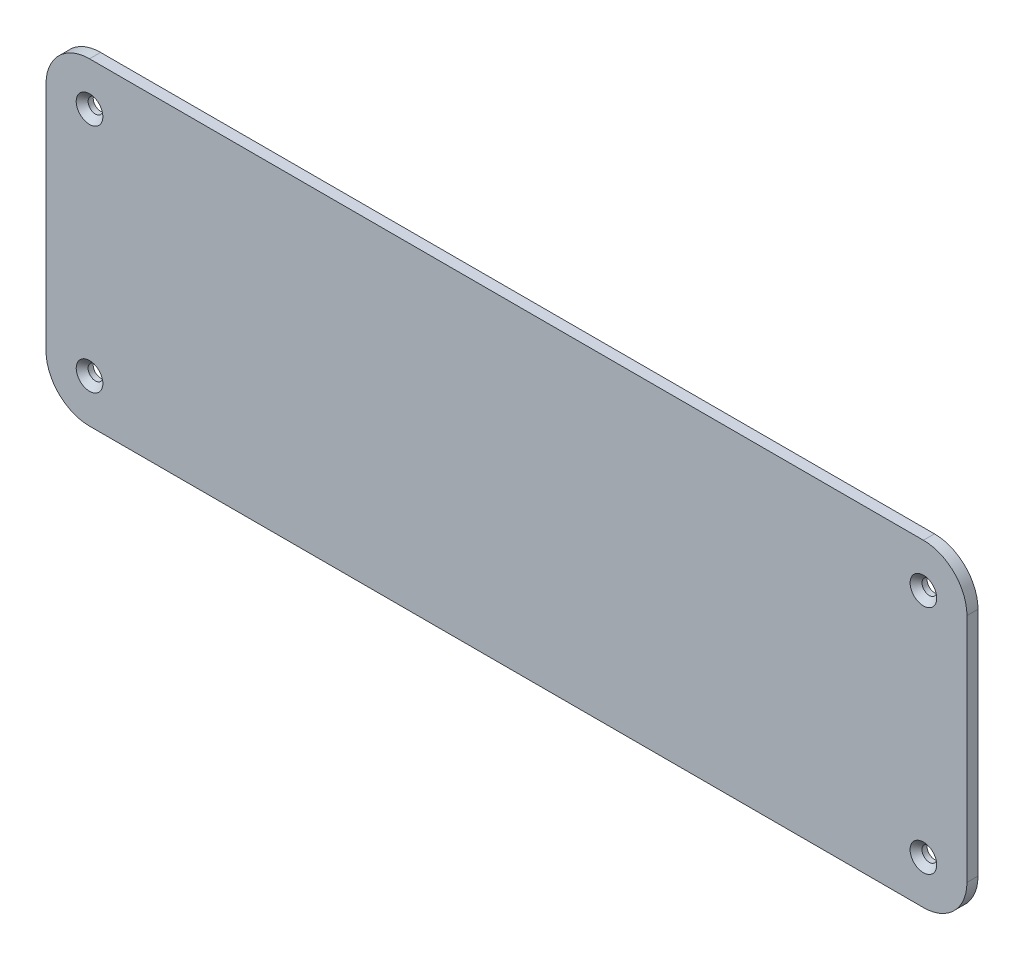
ISO-10303-21;
HEADER;
FILE_DESCRIPTION(('STEP AP214'),'2;1');
FILE_NAME('part.step','',(''),(''),'','','');
FILE_SCHEMA(('AUTOMOTIVE_DESIGN { 1 0 10303 214 1 1 1 1 }'));
ENDSEC;
DATA;
#1=APPLICATION_CONTEXT('core data for automotive mechanical design processes');
#2=APPLICATION_PROTOCOL_DEFINITION('international standard','automotive_design',2000,#1);
#3=PRODUCT_CONTEXT('',#1,'mechanical');
#4=PRODUCT('Part','Part','',(#3));
#5=PRODUCT_RELATED_PRODUCT_CATEGORY('part','',(#4));
#6=PRODUCT_DEFINITION_FORMATION('','',#4);
#7=PRODUCT_DEFINITION_CONTEXT('part definition',#1,'design');
#8=PRODUCT_DEFINITION('design','',#6,#7);
#9=PRODUCT_DEFINITION_SHAPE('','',#8);
#10=(LENGTH_UNIT() NAMED_UNIT(*) SI_UNIT(.MILLI.,.METRE.));
#11=(NAMED_UNIT(*) PLANE_ANGLE_UNIT() SI_UNIT($,.RADIAN.));
#12=(NAMED_UNIT(*) SI_UNIT($,.STERADIAN.) SOLID_ANGLE_UNIT());
#13=UNCERTAINTY_MEASURE_WITH_UNIT(LENGTH_MEASURE(1.E-05),#10,'distance_accuracy_value','');
#14=(GEOMETRIC_REPRESENTATION_CONTEXT(3) GLOBAL_UNCERTAINTY_ASSIGNED_CONTEXT((#13)) GLOBAL_UNIT_ASSIGNED_CONTEXT((#10,
#11,#12)) REPRESENTATION_CONTEXT('',''));
#15=CARTESIAN_POINT('',(0.,0.,0.));
#16=DIRECTION('',(0.,0.,1.));
#17=DIRECTION('',(1.,0.,0.));
#18=AXIS2_PLACEMENT_3D('',#15,#16,#17);
#19=CARTESIAN_POINT('',(124.5,-34.5,325.946730519527));
#20=DIRECTION('',(0.,0.,-1.));
#21=DIRECTION('',(-1.,0.,0.));
#22=AXIS2_PLACEMENT_3D('',#19,#20,#21);
#23=CYLINDRICAL_SURFACE('',#22,13.);
#24=DIRECTION('',(0.,0.,-1.));
#25=VECTOR('',#24,1.);
#26=CARTESIAN_POINT('',(124.500000000012,-47.5,325.946730519527));
#27=LINE('',#26,#25);
#28=CARTESIAN_POINT('',(124.500000000012,-47.5,35.));
#29=VERTEX_POINT('',#28);
#30=CARTESIAN_POINT('',(124.500000000012,-47.5,31.7));
#31=VERTEX_POINT('',#30);
#32=EDGE_CURVE('E145',#29,#31,#27,.T.);
#33=ORIENTED_EDGE('',*,*,#32,.T.);
#34=CARTESIAN_POINT('',(124.5,-34.5,31.7));
#35=DIRECTION('',(0.,0.,1.));
#36=DIRECTION('',(1.,0.,0.));
#37=AXIS2_PLACEMENT_3D('',#34,#35,#36);
#38=CIRCLE('',#37,13.);
#39=CARTESIAN_POINT('',(137.499999999992,-34.49999999998,31.7));
#40=VERTEX_POINT('',#39);
#41=EDGE_CURVE('E42',#31,#40,#38,.T.);
#42=ORIENTED_EDGE('',*,*,#41,.T.);
#43=DIRECTION('',(0.,0.,-1.));
#44=VECTOR('',#43,1.);
#45=CARTESIAN_POINT('',(137.499999999992,-34.49999999998,325.946730519527));
#46=LINE('',#45,#44);
#47=CARTESIAN_POINT('',(137.499999999992,-34.49999999998,35.));
#48=VERTEX_POINT('',#47);
#49=EDGE_CURVE('E147',#48,#40,#46,.T.);
#50=ORIENTED_EDGE('',*,*,#49,.F.);
#51=CARTESIAN_POINT('',(124.5,-34.5,35.));
#52=DIRECTION('',(0.,0.,1.));
#53=DIRECTION('',(1.,0.,0.));
#54=AXIS2_PLACEMENT_3D('',#51,#52,#53);
#55=CIRCLE('',#54,13.);
#56=EDGE_CURVE('E141',#29,#48,#55,.T.);
#57=ORIENTED_EDGE('',*,*,#56,.F.);
#58=EDGE_LOOP('',(#33,#42,#50,#57));
#59=FACE_BOUND('',#58,.T.);
#60=ADVANCED_FACE('F33',(#59),#23,.T.);
#61=CARTESIAN_POINT('',(137.499999999875,-291545.,325.946730519527));
#62=DIRECTION('',(-1.,0.,0.));
#63=DIRECTION('',(0.,-1.,0.));
#64=AXIS2_PLACEMENT_3D('',#61,#62,#63);
#65=PLANE('',#64);
#66=ORIENTED_EDGE('',*,*,#49,.T.);
#67=DIRECTION('',(0.,1.,0.));
#68=VECTOR('',#67,1.);
#69=CARTESIAN_POINT('',(137.499999999875,-291545.,31.7));
#70=LINE('',#69,#68);
#71=CARTESIAN_POINT('',(137.5,34.5000000000368,31.7));
#72=VERTEX_POINT('',#71);
#73=EDGE_CURVE('E169',#40,#72,#70,.T.);
#74=ORIENTED_EDGE('',*,*,#73,.T.);
#75=DIRECTION('',(0.,0.,-1.));
#76=VECTOR('',#75,1.);
#77=CARTESIAN_POINT('',(137.5,34.5000000000368,325.946730519527));
#78=LINE('',#77,#76);
#79=CARTESIAN_POINT('',(137.5,34.5000000000368,35.));
#80=VERTEX_POINT('',#79);
#81=EDGE_CURVE('E150',#80,#72,#78,.T.);
#82=ORIENTED_EDGE('',*,*,#81,.F.);
#83=DIRECTION('',(0.,1.,0.));
#84=VECTOR('',#83,1.);
#85=CARTESIAN_POINT('',(137.499999999875,-291545.,35.));
#86=LINE('',#85,#84);
#87=EDGE_CURVE('E138',#48,#80,#86,.T.);
#88=ORIENTED_EDGE('',*,*,#87,.F.);
#89=EDGE_LOOP('',(#66,#74,#82,#88));
#90=FACE_BOUND('',#89,.T.);
#91=ADVANCED_FACE('F238',(#90),#65,.F.);
#92=CARTESIAN_POINT('',(124.5,34.5,325.946730519527));
#93=DIRECTION('',(0.,0.,-1.));
#94=DIRECTION('',(-1.,0.,0.));
#95=AXIS2_PLACEMENT_3D('',#92,#93,#94);
#96=CYLINDRICAL_SURFACE('',#95,13.);
#97=ORIENTED_EDGE('',*,*,#81,.T.);
#98=CARTESIAN_POINT('',(124.5,34.5,31.7));
#99=DIRECTION('',(0.,0.,1.));
#100=DIRECTION('',(1.,0.,0.));
#101=AXIS2_PLACEMENT_3D('',#98,#99,#100);
#102=CIRCLE('',#101,13.);
#103=CARTESIAN_POINT('',(124.500000000012,47.5000000000126,31.7));
#104=VERTEX_POINT('',#103);
#105=EDGE_CURVE('E167',#72,#104,#102,.T.);
#106=ORIENTED_EDGE('',*,*,#105,.T.);
#107=DIRECTION('',(0.,0.,-1.));
#108=VECTOR('',#107,1.);
#109=CARTESIAN_POINT('',(124.500000000012,47.5000000000126,325.946730519527));
#110=LINE('',#109,#108);
#111=CARTESIAN_POINT('',(124.500000000012,47.5000000000126,35.));
#112=VERTEX_POINT('',#111);
#113=EDGE_CURVE('E153',#112,#104,#110,.T.);
#114=ORIENTED_EDGE('',*,*,#113,.F.);
#115=CARTESIAN_POINT('',(124.5,34.5,35.));
#116=DIRECTION('',(0.,0.,1.));
#117=DIRECTION('',(1.,0.,0.));
#118=AXIS2_PLACEMENT_3D('',#115,#116,#117);
#119=CIRCLE('',#118,13.);
#120=EDGE_CURVE('E135',#80,#112,#119,.T.);
#121=ORIENTED_EDGE('',*,*,#120,.F.);
#122=EDGE_LOOP('',(#97,#106,#114,#121));
#123=FACE_BOUND('',#122,.T.);
#124=ADVANCED_FACE('F234',(#123),#96,.T.);
#125=CARTESIAN_POINT('',(-400000.,47.4999999999568,325.946730519527));
#126=DIRECTION('',(0.,-1.,0.));
#127=DIRECTION('',(1.,0.,0.));
#128=AXIS2_PLACEMENT_3D('',#125,#126,#127);
#129=PLANE('',#128);
#130=ORIENTED_EDGE('',*,*,#113,.T.);
#131=DIRECTION('',(-1.,0.,0.));
#132=VECTOR('',#131,1.);
#133=CARTESIAN_POINT('',(-400000.,47.4999999999568,31.7));
#134=LINE('',#133,#132);
#135=CARTESIAN_POINT('',(-124.500000000012,47.5,31.7));
#136=VERTEX_POINT('',#135);
#137=EDGE_CURVE('E165',#104,#136,#134,.T.);
#138=ORIENTED_EDGE('',*,*,#137,.T.);
#139=DIRECTION('',(0.,0.,-1.));
#140=VECTOR('',#139,1.);
#141=CARTESIAN_POINT('',(-124.500000000012,47.5,325.946730519527));
#142=LINE('',#141,#140);
#143=CARTESIAN_POINT('',(-124.500000000012,47.5,35.));
#144=VERTEX_POINT('',#143);
#145=EDGE_CURVE('E156',#144,#136,#142,.T.);
#146=ORIENTED_EDGE('',*,*,#145,.F.);
#147=DIRECTION('',(-1.,0.,0.));
#148=VECTOR('',#147,1.);
#149=CARTESIAN_POINT('',(-400000.,47.4999999999568,35.));
#150=LINE('',#149,#148);
#151=EDGE_CURVE('E128',#112,#144,#150,.T.);
#152=ORIENTED_EDGE('',*,*,#151,.F.);
#153=EDGE_LOOP('',(#130,#138,#146,#152));
#154=FACE_BOUND('',#153,.T.);
#155=ADVANCED_FACE('F230',(#154),#129,.F.);
#156=CARTESIAN_POINT('',(-124.5,34.5,325.946730519527));
#157=DIRECTION('',(0.,0.,-1.));
#158=DIRECTION('',(-1.,0.,0.));
#159=AXIS2_PLACEMENT_3D('',#156,#157,#158);
#160=CYLINDRICAL_SURFACE('',#159,13.);
#161=ORIENTED_EDGE('',*,*,#145,.T.);
#162=CARTESIAN_POINT('',(-124.5,34.5,31.7));
#163=DIRECTION('',(0.,0.,1.));
#164=DIRECTION('',(1.,0.,0.));
#165=AXIS2_PLACEMENT_3D('',#162,#163,#164);
#166=CIRCLE('',#165,13.);
#167=CARTESIAN_POINT('',(-137.499999999985,34.49999999998,31.7));
#168=VERTEX_POINT('',#167);
#169=EDGE_CURVE('E163',#136,#168,#166,.T.);
#170=ORIENTED_EDGE('',*,*,#169,.T.);
#171=DIRECTION('',(0.,0.,-1.));
#172=VECTOR('',#171,1.);
#173=CARTESIAN_POINT('',(-137.499999999985,34.49999999998,325.946730519527));
#174=LINE('',#173,#172);
#175=CARTESIAN_POINT('',(-137.499999999985,34.49999999998,35.));
#176=VERTEX_POINT('',#175);
#177=EDGE_CURVE('E111',#176,#168,#174,.T.);
#178=ORIENTED_EDGE('',*,*,#177,.F.);
#179=CARTESIAN_POINT('',(-124.5,34.5,35.));
#180=DIRECTION('',(0.,0.,1.));
#181=DIRECTION('',(1.,0.,0.));
#182=AXIS2_PLACEMENT_3D('',#179,#180,#181);
#183=CIRCLE('',#182,13.);
#184=EDGE_CURVE('E124',#144,#176,#183,.T.);
#185=ORIENTED_EDGE('',*,*,#184,.F.);
#186=EDGE_LOOP('',(#161,#170,#178,#185));
#187=FACE_BOUND('',#186,.T.);
#188=ADVANCED_FACE('F227',(#187),#160,.T.);
#189=CARTESIAN_POINT('',(0.,0.,35.));
#190=DIRECTION('',(0.,0.,1.));
#191=DIRECTION('',(1.,0.,0.));
#192=AXIS2_PLACEMENT_3D('',#189,#190,#191);
#193=PLANE('',#192);
#194=CARTESIAN_POINT('',(124.5,-34.5,35.));
#195=DIRECTION('',(0.,0.,1.));
#196=DIRECTION('',(1.,0.,0.));
#197=AXIS2_PLACEMENT_3D('',#194,#195,#196);
#198=CIRCLE('',#197,3.97500000000001);
#199=CARTESIAN_POINT('',(128.475,-34.5,35.));
#200=VERTEX_POINT('',#199);
#201=EDGE_CURVE('E253',#200,#200,#198,.T.);
#202=ORIENTED_EDGE('',*,*,#201,.F.);
#203=EDGE_LOOP('',(#202));
#204=FACE_BOUND('',#203,.T.);
#205=CARTESIAN_POINT('',(-124.5,34.5,35.));
#206=DIRECTION('',(0.,0.,1.));
#207=DIRECTION('',(1.,0.,0.));
#208=AXIS2_PLACEMENT_3D('',#205,#206,#207);
#209=CIRCLE('',#208,3.97500000000001);
#210=CARTESIAN_POINT('',(-120.525,34.5,35.));
#211=VERTEX_POINT('',#210);
#212=EDGE_CURVE('E187',#211,#211,#209,.T.);
#213=ORIENTED_EDGE('',*,*,#212,.F.);
#214=EDGE_LOOP('',(#213));
#215=FACE_BOUND('',#214,.T.);
#216=CARTESIAN_POINT('',(124.5,34.5,35.));
#217=DIRECTION('',(0.,0.,1.));
#218=DIRECTION('',(1.,0.,0.));
#219=AXIS2_PLACEMENT_3D('',#216,#217,#218);
#220=CIRCLE('',#219,3.97500000000001);
#221=CARTESIAN_POINT('',(128.475,34.5,35.));
#222=VERTEX_POINT('',#221);
#223=EDGE_CURVE('E180',#222,#222,#220,.T.);
#224=ORIENTED_EDGE('',*,*,#223,.F.);
#225=EDGE_LOOP('',(#224));
#226=FACE_BOUND('',#225,.T.);
#227=CARTESIAN_POINT('',(-124.5,-34.5,35.));
#228=DIRECTION('',(0.,0.,1.));
#229=DIRECTION('',(1.,0.,0.));
#230=AXIS2_PLACEMENT_3D('',#227,#228,#229);
#231=CIRCLE('',#230,3.97500000000001);
#232=CARTESIAN_POINT('',(-120.525,-34.5,35.));
#233=VERTEX_POINT('',#232);
#234=EDGE_CURVE('E176',#233,#233,#231,.T.);
#235=ORIENTED_EDGE('',*,*,#234,.F.);
#236=EDGE_LOOP('',(#235));
#237=FACE_BOUND('',#236,.T.);
#238=CARTESIAN_POINT('',(-124.5,-34.5,35.));
#239=DIRECTION('',(0.,0.,1.));
#240=DIRECTION('',(1.,0.,0.));
#241=AXIS2_PLACEMENT_3D('',#238,#239,#240);
#242=CIRCLE('',#241,13.);
#243=CARTESIAN_POINT('',(-137.5,-34.5000000000368,35.));
#244=VERTEX_POINT('',#243);
#245=CARTESIAN_POINT('',(-124.500000000012,-47.5,35.));
#246=VERTEX_POINT('',#245);
#247=EDGE_CURVE('E110',#244,#246,#242,.T.);
#248=ORIENTED_EDGE('',*,*,#247,.T.);
#249=DIRECTION('',(1.,0.,0.));
#250=VECTOR('',#249,1.);
#251=CARTESIAN_POINT('',(-400000.,-47.5000000000705,35.));
#252=LINE('',#251,#250);
#253=EDGE_CURVE('E119',#246,#29,#252,.T.);
#254=ORIENTED_EDGE('',*,*,#253,.T.);
#255=ORIENTED_EDGE('',*,*,#56,.T.);
#256=ORIENTED_EDGE('',*,*,#87,.T.);
#257=ORIENTED_EDGE('',*,*,#120,.T.);
#258=ORIENTED_EDGE('',*,*,#151,.T.);
#259=ORIENTED_EDGE('',*,*,#184,.T.);
#260=DIRECTION('',(0.,-1.,0.));
#261=VECTOR('',#260,1.);
#262=CARTESIAN_POINT('',(-137.500000000102,-291545.,35.));
#263=LINE('',#262,#261);
#264=EDGE_CURVE('E103',#176,#244,#263,.T.);
#265=ORIENTED_EDGE('',*,*,#264,.T.);
#266=EDGE_LOOP('',(#248,#254,#255,#256,#257,#258,#259,#265));
#267=FACE_BOUND('',#266,.T.);
#268=ADVANCED_FACE('F122',(#204,#215,#226,#237,#267),#193,.T.);
#269=CARTESIAN_POINT('',(-400000.,-47.5000000000705,325.946730519527));
#270=DIRECTION('',(0.,1.,0.));
#271=DIRECTION('',(-1.,0.,0.));
#272=AXIS2_PLACEMENT_3D('',#269,#270,#271);
#273=PLANE('',#272);
#274=DIRECTION('',(0.,0.,-1.));
#275=VECTOR('',#274,1.);
#276=CARTESIAN_POINT('',(-124.500000000012,-47.5,325.946730519527));
#277=LINE('',#276,#275);
#278=CARTESIAN_POINT('',(-124.500000000012,-47.5,31.7));
#279=VERTEX_POINT('',#278);
#280=EDGE_CURVE('E115',#246,#279,#277,.T.);
#281=ORIENTED_EDGE('',*,*,#280,.T.);
#282=DIRECTION('',(1.,0.,0.));
#283=VECTOR('',#282,1.);
#284=CARTESIAN_POINT('',(-400000.,-47.5000000000705,31.7));
#285=LINE('',#284,#283);
#286=EDGE_CURVE('E11',#279,#31,#285,.T.);
#287=ORIENTED_EDGE('',*,*,#286,.T.);
#288=ORIENTED_EDGE('',*,*,#32,.F.);
#289=ORIENTED_EDGE('',*,*,#253,.F.);
#290=EDGE_LOOP('',(#281,#287,#288,#289));
#291=FACE_BOUND('',#290,.T.);
#292=ADVANCED_FACE('F224',(#291),#273,.F.);
#293=CARTESIAN_POINT('',(-137.500000000102,-291545.,325.946730519527));
#294=DIRECTION('',(1.,0.,0.));
#295=DIRECTION('',(0.,1.,0.));
#296=AXIS2_PLACEMENT_3D('',#293,#294,#295);
#297=PLANE('',#296);
#298=ORIENTED_EDGE('',*,*,#177,.T.);
#299=DIRECTION('',(0.,-1.,0.));
#300=VECTOR('',#299,1.);
#301=CARTESIAN_POINT('',(-137.500000000102,-291545.,31.7));
#302=LINE('',#301,#300);
#303=CARTESIAN_POINT('',(-137.5,-34.5000000000368,31.7));
#304=VERTEX_POINT('',#303);
#305=EDGE_CURVE('E106',#168,#304,#302,.T.);
#306=ORIENTED_EDGE('',*,*,#305,.T.);
#307=DIRECTION('',(0.,0.,-1.));
#308=VECTOR('',#307,1.);
#309=CARTESIAN_POINT('',(-137.5,-34.5000000000368,325.946730519527));
#310=LINE('',#309,#308);
#311=EDGE_CURVE('E98',#244,#304,#310,.T.);
#312=ORIENTED_EDGE('',*,*,#311,.F.);
#313=ORIENTED_EDGE('',*,*,#264,.F.);
#314=EDGE_LOOP('',(#298,#306,#312,#313));
#315=FACE_BOUND('',#314,.T.);
#316=ADVANCED_FACE('F101',(#315),#297,.F.);
#317=CARTESIAN_POINT('',(-124.5,-34.5,325.946730519527));
#318=DIRECTION('',(0.,0.,-1.));
#319=DIRECTION('',(-1.,0.,0.));
#320=AXIS2_PLACEMENT_3D('',#317,#318,#319);
#321=CYLINDRICAL_SURFACE('',#320,13.);
#322=ORIENTED_EDGE('',*,*,#311,.T.);
#323=CARTESIAN_POINT('',(-124.5,-34.5,31.7));
#324=DIRECTION('',(0.,0.,1.));
#325=DIRECTION('',(1.,0.,0.));
#326=AXIS2_PLACEMENT_3D('',#323,#324,#325);
#327=CIRCLE('',#326,13.);
#328=EDGE_CURVE('E125',#304,#279,#327,.T.);
#329=ORIENTED_EDGE('',*,*,#328,.T.);
#330=ORIENTED_EDGE('',*,*,#280,.F.);
#331=ORIENTED_EDGE('',*,*,#247,.F.);
#332=EDGE_LOOP('',(#322,#329,#330,#331));
#333=FACE_BOUND('',#332,.T.);
#334=ADVANCED_FACE('F114',(#333),#321,.T.);
#335=CARTESIAN_POINT('',(0.,0.,31.7));
#336=DIRECTION('',(0.,0.,1.));
#337=DIRECTION('',(1.,0.,0.));
#338=AXIS2_PLACEMENT_3D('',#335,#336,#337);
#339=PLANE('',#338);
#340=CARTESIAN_POINT('',(124.5,-34.5,31.7));
#341=DIRECTION('',(0.,0.,1.));
#342=DIRECTION('',(1.,0.,0.));
#343=AXIS2_PLACEMENT_3D('',#340,#341,#342);
#344=CIRCLE('',#343,2.19999999999998);
#345=CARTESIAN_POINT('',(126.7,-34.5,31.7));
#346=VERTEX_POINT('',#345);
#347=EDGE_CURVE('E37',#346,#346,#344,.T.);
#348=ORIENTED_EDGE('',*,*,#347,.T.);
#349=EDGE_LOOP('',(#348));
#350=FACE_BOUND('',#349,.T.);
#351=CARTESIAN_POINT('',(-124.5,34.5,31.7));
#352=DIRECTION('',(0.,0.,1.));
#353=DIRECTION('',(1.,0.,0.));
#354=AXIS2_PLACEMENT_3D('',#351,#352,#353);
#355=CIRCLE('',#354,2.19999999999999);
#356=CARTESIAN_POINT('',(-122.3,34.5,31.7));
#357=VERTEX_POINT('',#356);
#358=EDGE_CURVE('E178',#357,#357,#355,.T.);
#359=ORIENTED_EDGE('',*,*,#358,.T.);
#360=EDGE_LOOP('',(#359));
#361=FACE_BOUND('',#360,.T.);
#362=CARTESIAN_POINT('',(124.5,34.5,31.7));
#363=DIRECTION('',(0.,0.,1.));
#364=DIRECTION('',(1.,0.,0.));
#365=AXIS2_PLACEMENT_3D('',#362,#363,#364);
#366=CIRCLE('',#365,2.19999999999998);
#367=CARTESIAN_POINT('',(126.7,34.5,31.7));
#368=VERTEX_POINT('',#367);
#369=EDGE_CURVE('E174',#368,#368,#366,.T.);
#370=ORIENTED_EDGE('',*,*,#369,.T.);
#371=EDGE_LOOP('',(#370));
#372=FACE_BOUND('',#371,.T.);
#373=CARTESIAN_POINT('',(-124.5,-34.5,31.7));
#374=DIRECTION('',(0.,0.,1.));
#375=DIRECTION('',(1.,0.,0.));
#376=AXIS2_PLACEMENT_3D('',#373,#374,#375);
#377=CIRCLE('',#376,2.19999999999999);
#378=CARTESIAN_POINT('',(-122.3,-34.5,31.7));
#379=VERTEX_POINT('',#378);
#380=EDGE_CURVE('E160',#379,#379,#377,.T.);
#381=ORIENTED_EDGE('',*,*,#380,.T.);
#382=EDGE_LOOP('',(#381));
#383=FACE_BOUND('',#382,.T.);
#384=ORIENTED_EDGE('',*,*,#328,.F.);
#385=ORIENTED_EDGE('',*,*,#305,.F.);
#386=ORIENTED_EDGE('',*,*,#169,.F.);
#387=ORIENTED_EDGE('',*,*,#137,.F.);
#388=ORIENTED_EDGE('',*,*,#105,.F.);
#389=ORIENTED_EDGE('',*,*,#73,.F.);
#390=ORIENTED_EDGE('',*,*,#41,.F.);
#391=ORIENTED_EDGE('',*,*,#286,.F.);
#392=EDGE_LOOP('',(#384,#385,#386,#387,#388,#389,#390,#391));
#393=FACE_BOUND('',#392,.T.);
#394=ADVANCED_FACE('F35',(#350,#361,#372,#383,#393),#339,.F.);
#395=CARTESIAN_POINT('',(-124.5,-34.5,35.));
#396=DIRECTION('',(0.,0.,1.));
#397=DIRECTION('',(1.,0.,0.));
#398=AXIS2_PLACEMENT_3D('',#395,#396,#397);
#399=CYLINDRICAL_SURFACE('',#398,2.19999999999999);
#400=CARTESIAN_POINT('',(-124.5,-34.5,33.225));
#401=DIRECTION('',(0.,0.,1.));
#402=DIRECTION('',(1.,0.,0.));
#403=AXIS2_PLACEMENT_3D('',#400,#401,#402);
#404=CIRCLE('',#403,2.19999999999999);
#405=CARTESIAN_POINT('',(-122.3,-34.5,33.225));
#406=VERTEX_POINT('',#405);
#407=EDGE_CURVE('E131',#406,#406,#404,.T.);
#408=ORIENTED_EDGE('',*,*,#407,.T.);
#409=EDGE_LOOP('',(#408));
#410=FACE_BOUND('',#409,.T.);
#411=ORIENTED_EDGE('',*,*,#380,.F.);
#412=EDGE_LOOP('',(#411));
#413=FACE_BOUND('',#412,.T.);
#414=ADVANCED_FACE('F202',(#410,#413),#399,.F.);
#415=CARTESIAN_POINT('',(-124.5,-34.5,35.));
#416=DIRECTION('',(0.,0.,1.));
#417=DIRECTION('',(1.,0.,0.));
#418=AXIS2_PLACEMENT_3D('',#415,#416,#417);
#419=CONICAL_SURFACE('',#418,3.97500000000001,0.785398163397452);
#420=ORIENTED_EDGE('',*,*,#407,.F.);
#421=EDGE_LOOP('',(#420));
#422=FACE_BOUND('',#421,.T.);
#423=ORIENTED_EDGE('',*,*,#234,.T.);
#424=EDGE_LOOP('',(#423));
#425=FACE_BOUND('',#424,.T.);
#426=ADVANCED_FACE('F205',(#422,#425),#419,.F.);
#427=CARTESIAN_POINT('',(124.5,34.5,35.));
#428=DIRECTION('',(0.,0.,1.));
#429=DIRECTION('',(1.,0.,0.));
#430=AXIS2_PLACEMENT_3D('',#427,#428,#429);
#431=CYLINDRICAL_SURFACE('',#430,2.19999999999998);
#432=CARTESIAN_POINT('',(124.5,34.5,33.225));
#433=DIRECTION('',(0.,0.,1.));
#434=DIRECTION('',(1.,0.,0.));
#435=AXIS2_PLACEMENT_3D('',#432,#433,#434);
#436=CIRCLE('',#435,2.19999999999998);
#437=CARTESIAN_POINT('',(126.7,34.5,33.225));
#438=VERTEX_POINT('',#437);
#439=EDGE_CURVE('E177',#438,#438,#436,.T.);
#440=ORIENTED_EDGE('',*,*,#439,.T.);
#441=EDGE_LOOP('',(#440));
#442=FACE_BOUND('',#441,.T.);
#443=ORIENTED_EDGE('',*,*,#369,.F.);
#444=EDGE_LOOP('',(#443));
#445=FACE_BOUND('',#444,.T.);
#446=ADVANCED_FACE('F207',(#442,#445),#431,.F.);
#447=CARTESIAN_POINT('',(124.5,34.5,35.));
#448=DIRECTION('',(0.,0.,1.));
#449=DIRECTION('',(1.,0.,0.));
#450=AXIS2_PLACEMENT_3D('',#447,#448,#449);
#451=CONICAL_SURFACE('',#450,3.97500000000001,0.785398163397456);
#452=ORIENTED_EDGE('',*,*,#439,.F.);
#453=EDGE_LOOP('',(#452));
#454=FACE_BOUND('',#453,.T.);
#455=ORIENTED_EDGE('',*,*,#223,.T.);
#456=EDGE_LOOP('',(#455));
#457=FACE_BOUND('',#456,.T.);
#458=ADVANCED_FACE('F213',(#454,#457),#451,.F.);
#459=CARTESIAN_POINT('',(-124.5,34.5,35.));
#460=DIRECTION('',(0.,0.,1.));
#461=DIRECTION('',(1.,0.,0.));
#462=AXIS2_PLACEMENT_3D('',#459,#460,#461);
#463=CYLINDRICAL_SURFACE('',#462,2.19999999999999);
#464=CARTESIAN_POINT('',(-124.5,34.5,33.225));
#465=DIRECTION('',(0.,0.,1.));
#466=DIRECTION('',(1.,0.,0.));
#467=AXIS2_PLACEMENT_3D('',#464,#465,#466);
#468=CIRCLE('',#467,2.19999999999999);
#469=CARTESIAN_POINT('',(-122.3,34.5,33.225));
#470=VERTEX_POINT('',#469);
#471=EDGE_CURVE('E181',#470,#470,#468,.T.);
#472=ORIENTED_EDGE('',*,*,#471,.T.);
#473=EDGE_LOOP('',(#472));
#474=FACE_BOUND('',#473,.T.);
#475=ORIENTED_EDGE('',*,*,#358,.F.);
#476=EDGE_LOOP('',(#475));
#477=FACE_BOUND('',#476,.T.);
#478=ADVANCED_FACE('F260',(#474,#477),#463,.F.);
#479=CARTESIAN_POINT('',(-124.5,34.5,35.));
#480=DIRECTION('',(0.,0.,1.));
#481=DIRECTION('',(1.,0.,0.));
#482=AXIS2_PLACEMENT_3D('',#479,#480,#481);
#483=CONICAL_SURFACE('',#482,3.97500000000001,0.785398163397452);
#484=ORIENTED_EDGE('',*,*,#471,.F.);
#485=EDGE_LOOP('',(#484));
#486=FACE_BOUND('',#485,.T.);
#487=ORIENTED_EDGE('',*,*,#212,.T.);
#488=EDGE_LOOP('',(#487));
#489=FACE_BOUND('',#488,.T.);
#490=ADVANCED_FACE('F266',(#486,#489),#483,.F.);
#491=CARTESIAN_POINT('',(124.5,-34.5,35.));
#492=DIRECTION('',(0.,0.,1.));
#493=DIRECTION('',(1.,0.,0.));
#494=AXIS2_PLACEMENT_3D('',#491,#492,#493);
#495=CYLINDRICAL_SURFACE('',#494,2.19999999999998);
#496=CARTESIAN_POINT('',(124.5,-34.5,33.225));
#497=DIRECTION('',(0.,0.,1.));
#498=DIRECTION('',(1.,0.,0.));
#499=AXIS2_PLACEMENT_3D('',#496,#497,#498);
#500=CIRCLE('',#499,2.19999999999998);
#501=CARTESIAN_POINT('',(126.7,-34.5,33.225));
#502=VERTEX_POINT('',#501);
#503=EDGE_CURVE('E285',#502,#502,#500,.T.);
#504=ORIENTED_EDGE('',*,*,#503,.T.);
#505=EDGE_LOOP('',(#504));
#506=FACE_BOUND('',#505,.T.);
#507=ORIENTED_EDGE('',*,*,#347,.F.);
#508=EDGE_LOOP('',(#507));
#509=FACE_BOUND('',#508,.T.);
#510=ADVANCED_FACE('F272',(#506,#509),#495,.F.);
#511=CARTESIAN_POINT('',(124.5,-34.5,35.));
#512=DIRECTION('',(0.,0.,1.));
#513=DIRECTION('',(1.,0.,0.));
#514=AXIS2_PLACEMENT_3D('',#511,#512,#513);
#515=CONICAL_SURFACE('',#514,3.97500000000001,0.785398163397456);
#516=ORIENTED_EDGE('',*,*,#503,.F.);
#517=EDGE_LOOP('',(#516));
#518=FACE_BOUND('',#517,.T.);
#519=ORIENTED_EDGE('',*,*,#201,.T.);
#520=EDGE_LOOP('',(#519));
#521=FACE_BOUND('',#520,.T.);
#522=ADVANCED_FACE('F276',(#518,#521),#515,.F.);
#523=CLOSED_SHELL('',(#60,#91,#124,#155,#188,#268,#292,#316,#334,#394,#414,#426,#446,#458,#478,
#490,#510,#522));
#524=MANIFOLD_SOLID_BREP('B2',#523);
#525=ADVANCED_BREP_SHAPE_REPRESENTATION('',(#18,#524),#14);
#526=SHAPE_DEFINITION_REPRESENTATION(#9,#525);
ENDSEC;
END-ISO-10303-21;
